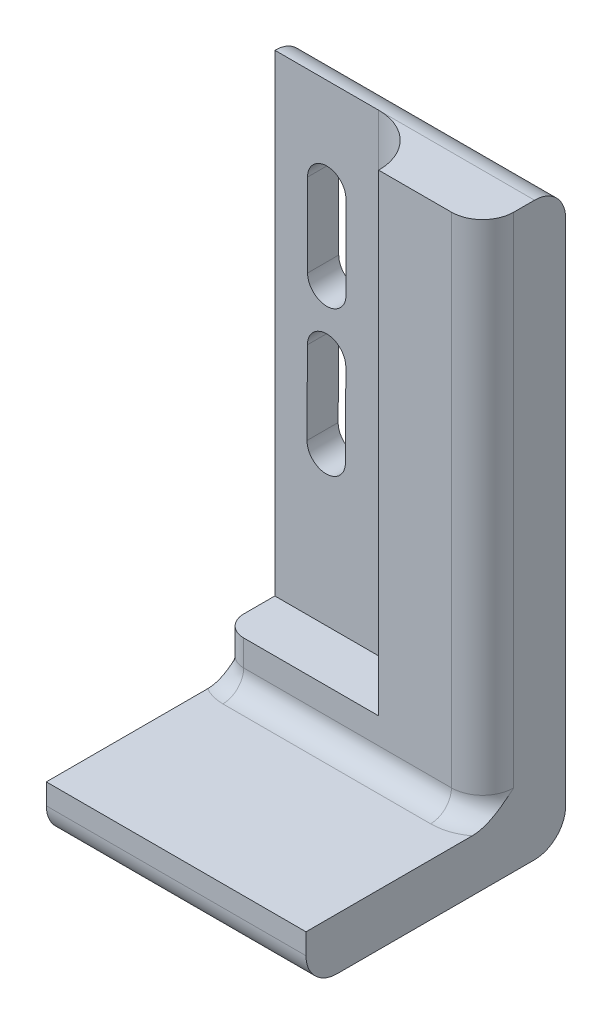
ISO-10303-21;
HEADER;
FILE_DESCRIPTION(('STEP AP214'),'2;1');
FILE_NAME('part.step','',(''),(''),'','','');
FILE_SCHEMA(('AUTOMOTIVE_DESIGN { 1 0 10303 214 1 1 1 1 }'));
ENDSEC;
DATA;
#1=APPLICATION_CONTEXT('core data for automotive mechanical design processes');
#2=APPLICATION_PROTOCOL_DEFINITION('international standard','automotive_design',2000,#1);
#3=PRODUCT_CONTEXT('',#1,'mechanical');
#4=PRODUCT('Part','Part','',(#3));
#5=PRODUCT_RELATED_PRODUCT_CATEGORY('part','',(#4));
#6=PRODUCT_DEFINITION_FORMATION('','',#4);
#7=PRODUCT_DEFINITION_CONTEXT('part definition',#1,'design');
#8=PRODUCT_DEFINITION('design','',#6,#7);
#9=PRODUCT_DEFINITION_SHAPE('','',#8);
#10=(LENGTH_UNIT() NAMED_UNIT(*) SI_UNIT(.MILLI.,.METRE.));
#11=(NAMED_UNIT(*) PLANE_ANGLE_UNIT() SI_UNIT($,.RADIAN.));
#12=(NAMED_UNIT(*) SI_UNIT($,.STERADIAN.) SOLID_ANGLE_UNIT());
#13=UNCERTAINTY_MEASURE_WITH_UNIT(LENGTH_MEASURE(1.E-05),#10,'distance_accuracy_value','');
#14=(GEOMETRIC_REPRESENTATION_CONTEXT(3) GLOBAL_UNCERTAINTY_ASSIGNED_CONTEXT((#13)) GLOBAL_UNIT_ASSIGNED_CONTEXT((#10,
#11,#12)) REPRESENTATION_CONTEXT('',''));
#15=CARTESIAN_POINT('',(0.,0.,0.));
#16=DIRECTION('',(0.,0.,1.));
#17=DIRECTION('',(1.,0.,0.));
#18=AXIS2_PLACEMENT_3D('',#15,#16,#17);
#19=CARTESIAN_POINT('',(0.,0.,0.));
#20=DIRECTION('',(0.,0.,-1.));
#21=DIRECTION('',(-1.,0.,0.));
#22=AXIS2_PLACEMENT_3D('',#19,#20,#21);
#23=PLANE('',#22);
#24=DIRECTION('',(0.,-1.,0.));
#25=VECTOR('',#24,1.);
#26=CARTESIAN_POINT('',(-11.8500000000004,8.00000000000205,0.));
#27=LINE('',#26,#25);
#28=CARTESIAN_POINT('',(-11.8500000000004,16.0000000000021,0.));
#29=VERTEX_POINT('',#28);
#30=CARTESIAN_POINT('',(-11.8500000000004,8.00000000000205,0.));
#31=VERTEX_POINT('',#30);
#32=EDGE_CURVE('E270',#29,#31,#27,.T.);
#33=ORIENTED_EDGE('',*,*,#32,.T.);
#34=CARTESIAN_POINT('',(-10.0000000000004,8.00000000000205,0.));
#35=DIRECTION('',(0.,0.,1.));
#36=DIRECTION('',(1.,0.,0.));
#37=AXIS2_PLACEMENT_3D('',#34,#35,#36);
#38=CIRCLE('',#37,1.85);
#39=CARTESIAN_POINT('',(-8.15000000000039,8.00000000000204,0.));
#40=VERTEX_POINT('',#39);
#41=EDGE_CURVE('E266',#31,#40,#38,.T.);
#42=ORIENTED_EDGE('',*,*,#41,.T.);
#43=DIRECTION('',(0.,1.,0.));
#44=VECTOR('',#43,1.);
#45=CARTESIAN_POINT('',(-8.15000000000039,8.00000000000204,0.));
#46=LINE('',#45,#44);
#47=CARTESIAN_POINT('',(-8.1500000000004,16.0000000000021,0.));
#48=VERTEX_POINT('',#47);
#49=EDGE_CURVE('E280',#40,#48,#46,.T.);
#50=ORIENTED_EDGE('',*,*,#49,.T.);
#51=CARTESIAN_POINT('',(-10.0000000000004,16.0000000000021,0.));
#52=DIRECTION('',(0.,0.,1.));
#53=DIRECTION('',(1.,0.,0.));
#54=AXIS2_PLACEMENT_3D('',#51,#52,#53);
#55=CIRCLE('',#54,1.85);
#56=EDGE_CURVE('E283',#48,#29,#55,.T.);
#57=ORIENTED_EDGE('',*,*,#56,.T.);
#58=EDGE_LOOP('',(#33,#42,#50,#57));
#59=FACE_BOUND('',#58,.T.);
#60=DIRECTION('',(0.00484216557138158,0.999988276647571,0.));
#61=VECTOR('',#60,1.);
#62=CARTESIAN_POINT('',(-8.16454818491653,1.99107716375229,0.));
#63=LINE('',#62,#61);
#64=CARTESIAN_POINT('',(-8.20328550948759,-6.00882904942832,0.));
#65=VERTEX_POINT('',#64);
#66=CARTESIAN_POINT('',(-8.16454818491653,1.99107716375229,0.));
#67=VERTEX_POINT('',#66);
#68=EDGE_CURVE('E239',#65,#67,#63,.T.);
#69=ORIENTED_EDGE('',*,*,#68,.T.);
#70=CARTESIAN_POINT('',(-10.0145264967145,2.00003517005933,0.));
#71=DIRECTION('',(0.,0.,1.));
#72=DIRECTION('',(-1.,0.,0.));
#73=AXIS2_PLACEMENT_3D('',#70,#71,#72);
#74=CIRCLE('',#73,1.85);
#75=CARTESIAN_POINT('',(-11.8645048085125,2.00899317636639,0.));
#76=VERTEX_POINT('',#75);
#77=EDGE_CURVE('E235',#67,#76,#74,.T.);
#78=ORIENTED_EDGE('',*,*,#77,.T.);
#79=DIRECTION('',(-0.00484216557138139,-0.999988276647571,0.));
#80=VECTOR('',#79,1.);
#81=CARTESIAN_POINT('',(-11.8645048085125,2.00899317636639,0.));
#82=LINE('',#81,#80);
#83=CARTESIAN_POINT('',(-11.9032421330836,-5.99091303681418,0.));
#84=VERTEX_POINT('',#83);
#85=EDGE_CURVE('E249',#76,#84,#82,.T.);
#86=ORIENTED_EDGE('',*,*,#85,.T.);
#87=CARTESIAN_POINT('',(-10.0532638212856,-5.99987104312124,0.));
#88=DIRECTION('',(0.,0.,1.));
#89=DIRECTION('',(-1.,0.,0.));
#90=AXIS2_PLACEMENT_3D('',#87,#88,#89);
#91=CIRCLE('',#90,1.85);
#92=EDGE_CURVE('E252',#84,#65,#91,.T.);
#93=ORIENTED_EDGE('',*,*,#92,.T.);
#94=EDGE_LOOP('',(#69,#78,#86,#93));
#95=FACE_BOUND('',#94,.T.);
#96=DIRECTION('',(0.,-1.,0.));
#97=VECTOR('',#96,1.);
#98=CARTESIAN_POINT('',(-15.,-25.,0.));
#99=LINE('',#98,#97);
#100=CARTESIAN_POINT('',(-15.,22.,0.));
#101=VERTEX_POINT('',#100);
#102=CARTESIAN_POINT('',(-15.,-27.,0.));
#103=VERTEX_POINT('',#102);
#104=EDGE_CURVE('E297',#101,#103,#99,.T.);
#105=ORIENTED_EDGE('',*,*,#104,.F.);
#106=DIRECTION('',(-1.,0.,0.));
#107=VECTOR('',#106,1.);
#108=CARTESIAN_POINT('',(10.,22.,0.));
#109=LINE('',#108,#107);
#110=CARTESIAN_POINT('',(10.,22.,0.));
#111=VERTEX_POINT('',#110);
#112=EDGE_CURVE('E348',#101,#111,#109,.F.);
#113=ORIENTED_EDGE('',*,*,#112,.T.);
#114=DIRECTION('',(0.,-1.,0.));
#115=VECTOR('',#114,1.);
#116=CARTESIAN_POINT('',(10.,25.,0.));
#117=LINE('',#116,#115);
#118=CARTESIAN_POINT('',(10.,-27.,0.));
#119=VERTEX_POINT('',#118);
#120=EDGE_CURVE('E485',#111,#119,#117,.T.);
#121=ORIENTED_EDGE('',*,*,#120,.T.);
#122=DIRECTION('',(1.,0.,0.));
#123=VECTOR('',#122,1.);
#124=CARTESIAN_POINT('',(-15.,-27.,0.));
#125=LINE('',#124,#123);
#126=EDGE_CURVE('E346',#119,#103,#125,.F.);
#127=ORIENTED_EDGE('',*,*,#126,.T.);
#128=EDGE_LOOP('',(#105,#113,#121,#127));
#129=FACE_BOUND('',#128,.T.);
#130=ADVANCED_FACE('F37',(#59,#95,#129),#23,.T.);
#131=CARTESIAN_POINT('',(-15.,25.,3.));
#132=DIRECTION('',(0.,-1.,0.));
#133=DIRECTION('',(0.,0.,-1.));
#134=AXIS2_PLACEMENT_3D('',#131,#132,#133);
#135=PLANE('',#134);
#136=DIRECTION('',(-1.,0.,0.));
#137=VECTOR('',#136,1.);
#138=CARTESIAN_POINT('',(0.,25.,8.));
#139=LINE('',#138,#137);
#140=CARTESIAN_POINT('',(7.,25.,8.));
#141=VERTEX_POINT('',#140);
#142=CARTESIAN_POINT('',(0.,25.,8.));
#143=VERTEX_POINT('',#142);
#144=EDGE_CURVE('E494',#141,#143,#139,.T.);
#145=ORIENTED_EDGE('',*,*,#144,.F.);
#146=CARTESIAN_POINT('',(7.,25.,5.));
#147=DIRECTION('',(0.,-1.,0.));
#148=DIRECTION('',(0.,0.,-1.));
#149=AXIS2_PLACEMENT_3D('',#146,#147,#148);
#150=CIRCLE('',#149,3.);
#151=CARTESIAN_POINT('',(10.,25.,5.));
#152=VERTEX_POINT('',#151);
#153=EDGE_CURVE('E330',#141,#152,#150,.F.);
#154=ORIENTED_EDGE('',*,*,#153,.T.);
#155=DIRECTION('',(0.,0.,-1.));
#156=VECTOR('',#155,1.);
#157=CARTESIAN_POINT('',(10.,25.,35.));
#158=LINE('',#157,#156);
#159=CARTESIAN_POINT('',(10.,25.,3.));
#160=VERTEX_POINT('',#159);
#161=EDGE_CURVE('E208',#152,#160,#158,.T.);
#162=ORIENTED_EDGE('',*,*,#161,.T.);
#163=DIRECTION('',(-1.,0.,0.));
#164=VECTOR('',#163,1.);
#165=CARTESIAN_POINT('',(-15.,25.,3.));
#166=LINE('',#165,#164);
#167=CARTESIAN_POINT('',(-5.,25.,3.));
#168=VERTEX_POINT('',#167);
#169=EDGE_CURVE('E327',#160,#168,#166,.T.);
#170=ORIENTED_EDGE('',*,*,#169,.T.);
#171=CARTESIAN_POINT('',(-5.,25.,8.));
#172=DIRECTION('',(0.,-1.,0.));
#173=DIRECTION('',(0.,0.,-1.));
#174=AXIS2_PLACEMENT_3D('',#171,#172,#173);
#175=CIRCLE('',#174,5.);
#176=EDGE_CURVE('E310',#168,#143,#175,.T.);
#177=ORIENTED_EDGE('',*,*,#176,.T.);
#178=EDGE_LOOP('',(#145,#154,#162,#170,#177));
#179=FACE_BOUND('',#178,.T.);
#180=ADVANCED_FACE('F391',(#179),#135,.F.);
#181=CARTESIAN_POINT('',(-15.,-30.,25.));
#182=DIRECTION('',(0.,1.,0.));
#183=DIRECTION('',(0.,0.,1.));
#184=AXIS2_PLACEMENT_3D('',#181,#182,#183);
#185=PLANE('',#184);
#186=DIRECTION('',(0.,0.,-1.));
#187=VECTOR('',#186,1.);
#188=CARTESIAN_POINT('',(10.,-30.,35.));
#189=LINE('',#188,#187);
#190=CARTESIAN_POINT('',(10.,-30.,22.));
#191=VERTEX_POINT('',#190);
#192=CARTESIAN_POINT('',(10.,-30.,3.));
#193=VERTEX_POINT('',#192);
#194=EDGE_CURVE('E488',#191,#193,#189,.T.);
#195=ORIENTED_EDGE('',*,*,#194,.F.);
#196=DIRECTION('',(1.,0.,0.));
#197=VECTOR('',#196,1.);
#198=CARTESIAN_POINT('',(-15.,-30.,22.));
#199=LINE('',#198,#197);
#200=CARTESIAN_POINT('',(-15.,-30.,22.));
#201=VERTEX_POINT('',#200);
#202=EDGE_CURVE('E344',#191,#201,#199,.F.);
#203=ORIENTED_EDGE('',*,*,#202,.T.);
#204=DIRECTION('',(0.,0.,-1.));
#205=VECTOR('',#204,1.);
#206=CARTESIAN_POINT('',(-15.,-30.,25.));
#207=LINE('',#206,#205);
#208=CARTESIAN_POINT('',(-15.,-30.,3.));
#209=VERTEX_POINT('',#208);
#210=EDGE_CURVE('E227',#201,#209,#207,.T.);
#211=ORIENTED_EDGE('',*,*,#210,.T.);
#212=DIRECTION('',(1.,0.,0.));
#213=VECTOR('',#212,1.);
#214=CARTESIAN_POINT('',(10.,-30.,3.));
#215=LINE('',#214,#213);
#216=EDGE_CURVE('E341',#209,#193,#215,.T.);
#217=ORIENTED_EDGE('',*,*,#216,.T.);
#218=EDGE_LOOP('',(#195,#203,#211,#217));
#219=FACE_BOUND('',#218,.T.);
#220=ADVANCED_FACE('F396',(#219),#185,.F.);
#221=CARTESIAN_POINT('',(-15.,-25.,25.));
#222=DIRECTION('',(0.,-1.,0.));
#223=DIRECTION('',(0.,0.,-1.));
#224=AXIS2_PLACEMENT_3D('',#221,#222,#223);
#225=PLANE('',#224);
#226=DIRECTION('',(1.,0.,0.));
#227=VECTOR('',#226,1.);
#228=CARTESIAN_POINT('',(-15.,-25.,10.));
#229=LINE('',#228,#227);
#230=CARTESIAN_POINT('',(7.,-25.,10.));
#231=VERTEX_POINT('',#230);
#232=CARTESIAN_POINT('',(-13.,-25.,10.));
#233=VERTEX_POINT('',#232);
#234=EDGE_CURVE('E350',#231,#233,#229,.F.);
#235=ORIENTED_EDGE('',*,*,#234,.T.);
#236=CARTESIAN_POINT('',(-13.,-25.,6.));
#237=DIRECTION('',(0.,-1.,0.));
#238=DIRECTION('',(0.,0.,-1.));
#239=AXIS2_PLACEMENT_3D('',#236,#237,#238);
#240=CIRCLE('',#239,4.);
#241=CARTESIAN_POINT('',(-15.,-25.,9.46410161513775));
#242=VERTEX_POINT('',#241);
#243=EDGE_CURVE('E354',#233,#242,#240,.T.);
#244=ORIENTED_EDGE('',*,*,#243,.T.);
#245=DIRECTION('',(0.,0.,-1.));
#246=VECTOR('',#245,1.);
#247=CARTESIAN_POINT('',(-15.,-25.,25.));
#248=LINE('',#247,#246);
#249=CARTESIAN_POINT('',(-15.,-25.,25.));
#250=VERTEX_POINT('',#249);
#251=EDGE_CURVE('E223',#250,#242,#248,.T.);
#252=ORIENTED_EDGE('',*,*,#251,.F.);
#253=DIRECTION('',(-1.,0.,0.));
#254=VECTOR('',#253,1.);
#255=CARTESIAN_POINT('',(-15.,-25.,25.));
#256=LINE('',#255,#254);
#257=CARTESIAN_POINT('',(10.,-25.,25.));
#258=VERTEX_POINT('',#257);
#259=EDGE_CURVE('E214',#258,#250,#256,.T.);
#260=ORIENTED_EDGE('',*,*,#259,.F.);
#261=DIRECTION('',(0.,0.,1.));
#262=VECTOR('',#261,1.);
#263=CARTESIAN_POINT('',(10.,-25.,25.));
#264=LINE('',#263,#262);
#265=CARTESIAN_POINT('',(10.,-25.,9.));
#266=VERTEX_POINT('',#265);
#267=EDGE_CURVE('E199',#266,#258,#264,.T.);
#268=ORIENTED_EDGE('',*,*,#267,.F.);
#269=CARTESIAN_POINT('',(7.,-25.,5.));
#270=DIRECTION('',(0.,-1.,0.));
#271=DIRECTION('',(0.,0.,-1.));
#272=AXIS2_PLACEMENT_3D('',#269,#270,#271);
#273=CIRCLE('',#272,5.);
#274=EDGE_CURVE('E352',#266,#231,#273,.T.);
#275=ORIENTED_EDGE('',*,*,#274,.T.);
#276=EDGE_LOOP('',(#235,#244,#252,#260,#268,#275));
#277=FACE_BOUND('',#276,.T.);
#278=ADVANCED_FACE('F220',(#277),#225,.F.);
#279=CARTESIAN_POINT('',(0.,0.,25.));
#280=DIRECTION('',(0.,0.,1.));
#281=DIRECTION('',(1.,0.,0.));
#282=AXIS2_PLACEMENT_3D('',#279,#280,#281);
#283=PLANE('',#282);
#284=DIRECTION('',(0.,-1.,0.));
#285=VECTOR('',#284,1.);
#286=CARTESIAN_POINT('',(-15.,-25.,25.));
#287=LINE('',#286,#285);
#288=CARTESIAN_POINT('',(-15.,-27.,25.));
#289=VERTEX_POINT('',#288);
#290=EDGE_CURVE('E225',#250,#289,#287,.T.);
#291=ORIENTED_EDGE('',*,*,#290,.T.);
#292=DIRECTION('',(1.,0.,0.));
#293=VECTOR('',#292,1.);
#294=CARTESIAN_POINT('',(10.,-27.,25.));
#295=LINE('',#294,#293);
#296=CARTESIAN_POINT('',(10.,-27.,25.));
#297=VERTEX_POINT('',#296);
#298=EDGE_CURVE('E217',#289,#297,#295,.T.);
#299=ORIENTED_EDGE('',*,*,#298,.T.);
#300=DIRECTION('',(0.,1.,0.));
#301=VECTOR('',#300,1.);
#302=CARTESIAN_POINT('',(10.,0.,25.));
#303=LINE('',#302,#301);
#304=EDGE_CURVE('E203',#297,#258,#303,.T.);
#305=ORIENTED_EDGE('',*,*,#304,.T.);
#306=ORIENTED_EDGE('',*,*,#259,.T.);
#307=EDGE_LOOP('',(#291,#299,#305,#306));
#308=FACE_BOUND('',#307,.T.);
#309=ADVANCED_FACE('F213',(#308),#283,.T.);
#310=CARTESIAN_POINT('',(0.,0.,8.));
#311=DIRECTION('',(0.,0.,1.));
#312=DIRECTION('',(1.,0.,0.));
#313=AXIS2_PLACEMENT_3D('',#310,#311,#312);
#314=PLANE('',#313);
#315=DIRECTION('',(0.,-1.,0.));
#316=VECTOR('',#315,1.);
#317=CARTESIAN_POINT('',(-13.,-25.,8.));
#318=LINE('',#317,#316);
#319=CARTESIAN_POINT('',(-13.,-20.5,8.));
#320=VERTEX_POINT('',#319);
#321=CARTESIAN_POINT('',(-13.,-23.,8.));
#322=VERTEX_POINT('',#321);
#323=EDGE_CURVE('E315',#320,#322,#318,.T.);
#324=ORIENTED_EDGE('',*,*,#323,.T.);
#325=DIRECTION('',(1.,0.,0.));
#326=VECTOR('',#325,1.);
#327=CARTESIAN_POINT('',(0.,-23.,8.));
#328=LINE('',#327,#326);
#329=CARTESIAN_POINT('',(7.,-23.,8.));
#330=VERTEX_POINT('',#329);
#331=EDGE_CURVE('E55',#322,#330,#328,.T.);
#332=ORIENTED_EDGE('',*,*,#331,.T.);
#333=DIRECTION('',(0.,1.,0.));
#334=VECTOR('',#333,1.);
#335=CARTESIAN_POINT('',(7.,0.,8.));
#336=LINE('',#335,#334);
#337=EDGE_CURVE('E313',#330,#141,#336,.T.);
#338=ORIENTED_EDGE('',*,*,#337,.T.);
#339=ORIENTED_EDGE('',*,*,#144,.T.);
#340=DIRECTION('',(0.,-1.,0.));
#341=VECTOR('',#340,1.);
#342=CARTESIAN_POINT('',(0.,0.,8.));
#343=LINE('',#342,#341);
#344=CARTESIAN_POINT('',(0.,-20.5,8.));
#345=VERTEX_POINT('',#344);
#346=EDGE_CURVE('E496',#143,#345,#343,.T.);
#347=ORIENTED_EDGE('',*,*,#346,.T.);
#348=DIRECTION('',(-1.,0.,0.));
#349=VECTOR('',#348,1.);
#350=CARTESIAN_POINT('',(0.,-20.5,8.));
#351=LINE('',#350,#349);
#352=EDGE_CURVE('E499',#345,#320,#351,.T.);
#353=ORIENTED_EDGE('',*,*,#352,.T.);
#354=EDGE_LOOP('',(#324,#332,#338,#339,#347,#353));
#355=FACE_BOUND('',#354,.T.);
#356=ADVANCED_FACE('F403',(#355),#314,.T.);
#357=CARTESIAN_POINT('',(0.,0.,3.));
#358=DIRECTION('',(0.,0.,-1.));
#359=DIRECTION('',(-1.,0.,0.));
#360=AXIS2_PLACEMENT_3D('',#357,#358,#359);
#361=PLANE('',#360);
#362=CARTESIAN_POINT('',(-10.0145264967145,2.00003517005933,3.));
#363=DIRECTION('',(0.,0.,1.));
#364=DIRECTION('',(-1.,0.,0.));
#365=AXIS2_PLACEMENT_3D('',#362,#363,#364);
#366=CIRCLE('',#365,1.85);
#367=CARTESIAN_POINT('',(-8.16454818491653,1.99107716375229,3.));
#368=VERTEX_POINT('',#367);
#369=CARTESIAN_POINT('',(-11.8645048085125,2.00899317636639,3.));
#370=VERTEX_POINT('',#369);
#371=EDGE_CURVE('E236',#368,#370,#366,.T.);
#372=ORIENTED_EDGE('',*,*,#371,.F.);
#373=DIRECTION('',(0.00484216557138158,0.999988276647571,0.));
#374=VECTOR('',#373,1.);
#375=CARTESIAN_POINT('',(-8.16454818491653,1.99107716375229,3.));
#376=LINE('',#375,#374);
#377=CARTESIAN_POINT('',(-8.20328550948758,-6.00882904942831,3.));
#378=VERTEX_POINT('',#377);
#379=EDGE_CURVE('E244',#378,#368,#376,.T.);
#380=ORIENTED_EDGE('',*,*,#379,.F.);
#381=CARTESIAN_POINT('',(-10.0532638212856,-5.99987104312124,3.));
#382=DIRECTION('',(0.,0.,1.));
#383=DIRECTION('',(-1.,0.,0.));
#384=AXIS2_PLACEMENT_3D('',#381,#382,#383);
#385=CIRCLE('',#384,1.85);
#386=CARTESIAN_POINT('',(-11.9032421330836,-5.99091303681418,3.));
#387=VERTEX_POINT('',#386);
#388=EDGE_CURVE('E241',#387,#378,#385,.T.);
#389=ORIENTED_EDGE('',*,*,#388,.F.);
#390=DIRECTION('',(-0.00484216557138139,-0.999988276647571,0.));
#391=VECTOR('',#390,1.);
#392=CARTESIAN_POINT('',(-11.8645048085125,2.00899317636639,3.));
#393=LINE('',#392,#391);
#394=EDGE_CURVE('E238',#370,#387,#393,.T.);
#395=ORIENTED_EDGE('',*,*,#394,.F.);
#396=EDGE_LOOP('',(#372,#380,#389,#395));
#397=FACE_BOUND('',#396,.T.);
#398=CARTESIAN_POINT('',(-10.0000000000004,8.00000000000205,3.));
#399=DIRECTION('',(0.,0.,1.));
#400=DIRECTION('',(1.,0.,0.));
#401=AXIS2_PLACEMENT_3D('',#398,#399,#400);
#402=CIRCLE('',#401,1.85);
#403=CARTESIAN_POINT('',(-11.8500000000004,8.00000000000205,3.));
#404=VERTEX_POINT('',#403);
#405=CARTESIAN_POINT('',(-8.15000000000039,8.00000000000204,3.));
#406=VERTEX_POINT('',#405);
#407=EDGE_CURVE('E267',#404,#406,#402,.T.);
#408=ORIENTED_EDGE('',*,*,#407,.F.);
#409=DIRECTION('',(0.,-1.,0.));
#410=VECTOR('',#409,1.);
#411=CARTESIAN_POINT('',(-11.8500000000004,8.00000000000205,3.));
#412=LINE('',#411,#410);
#413=CARTESIAN_POINT('',(-11.8500000000004,16.0000000000021,3.));
#414=VERTEX_POINT('',#413);
#415=EDGE_CURVE('E275',#414,#404,#412,.T.);
#416=ORIENTED_EDGE('',*,*,#415,.F.);
#417=CARTESIAN_POINT('',(-10.0000000000004,16.0000000000021,3.));
#418=DIRECTION('',(0.,0.,1.));
#419=DIRECTION('',(1.,0.,0.));
#420=AXIS2_PLACEMENT_3D('',#417,#418,#419);
#421=CIRCLE('',#420,1.85);
#422=CARTESIAN_POINT('',(-8.1500000000004,16.0000000000021,3.));
#423=VERTEX_POINT('',#422);
#424=EDGE_CURVE('E272',#423,#414,#421,.T.);
#425=ORIENTED_EDGE('',*,*,#424,.F.);
#426=DIRECTION('',(0.,1.,0.));
#427=VECTOR('',#426,1.);
#428=CARTESIAN_POINT('',(-8.15000000000039,8.00000000000204,3.));
#429=LINE('',#428,#427);
#430=EDGE_CURVE('E269',#406,#423,#429,.T.);
#431=ORIENTED_EDGE('',*,*,#430,.F.);
#432=EDGE_LOOP('',(#408,#416,#425,#431));
#433=FACE_BOUND('',#432,.T.);
#434=DIRECTION('',(-1.,0.,0.));
#435=VECTOR('',#434,1.);
#436=CARTESIAN_POINT('',(0.,-20.5,3.));
#437=LINE('',#436,#435);
#438=CARTESIAN_POINT('',(-5.,-20.5,3.));
#439=VERTEX_POINT('',#438);
#440=CARTESIAN_POINT('',(-15.,-20.5,3.));
#441=VERTEX_POINT('',#440);
#442=EDGE_CURVE('E218',#439,#441,#437,.T.);
#443=ORIENTED_EDGE('',*,*,#442,.F.);
#444=DIRECTION('',(0.,-1.,0.));
#445=VECTOR('',#444,1.);
#446=CARTESIAN_POINT('',(-5.,25.,3.));
#447=LINE('',#446,#445);
#448=EDGE_CURVE('E307',#439,#168,#447,.F.);
#449=ORIENTED_EDGE('',*,*,#448,.T.);
#450=DIRECTION('',(-1.,0.,0.));
#451=VECTOR('',#450,1.);
#452=CARTESIAN_POINT('',(-15.,25.,3.));
#453=LINE('',#452,#451);
#454=CARTESIAN_POINT('',(-15.,25.,3.));
#455=VERTEX_POINT('',#454);
#456=EDGE_CURVE('E298',#168,#455,#453,.T.);
#457=ORIENTED_EDGE('',*,*,#456,.T.);
#458=DIRECTION('',(0.,-1.,0.));
#459=VECTOR('',#458,1.);
#460=CARTESIAN_POINT('',(-15.,-25.,3.));
#461=LINE('',#460,#459);
#462=EDGE_CURVE('E300',#455,#441,#461,.T.);
#463=ORIENTED_EDGE('',*,*,#462,.T.);
#464=EDGE_LOOP('',(#443,#449,#457,#463));
#465=FACE_BOUND('',#464,.T.);
#466=ADVANCED_FACE('F400',(#397,#433,#465),#361,.F.);
#467=CARTESIAN_POINT('',(-15.,-25.,3.));
#468=DIRECTION('',(1.,0.,0.));
#469=DIRECTION('',(0.,0.,-1.));
#470=AXIS2_PLACEMENT_3D('',#467,#468,#469);
#471=PLANE('',#470);
#472=ORIENTED_EDGE('',*,*,#251,.T.);
#473=CARTESIAN_POINT('',(-15.,-25.,9.46410161513775));
#474=CARTESIAN_POINT('',(-15.,-25.0000118494146,9.37840629812424));
#475=CARTESIAN_POINT('',(-15.,-24.995871060249,9.29276105949715));
#476=CARTESIAN_POINT('',(-15.,-24.9798529395462,9.12232102480822));
#477=CARTESIAN_POINT('',(-15.,-24.9679873814855,9.03752513361608));
#478=CARTESIAN_POINT('',(-15.,-24.9372712269331,8.87028314530651));
#479=CARTESIAN_POINT('',(-15.,-24.9185064976321,8.78782104681794));
#480=CARTESIAN_POINT('',(-15.,-24.8745611709319,8.62459895216407));
#481=CARTESIAN_POINT('',(-15.,-24.8493775087196,8.5438397890896));
#482=CARTESIAN_POINT('',(-15.,-24.7827529457404,8.35473249508657));
#483=CARTESIAN_POINT('',(-15.,-24.7387483878324,8.24728415660278));
#484=CARTESIAN_POINT('',(-15.,-24.6413542826815,8.03669276727359));
#485=CARTESIAN_POINT('',(-15.,-24.5879572292124,7.93355324211471));
#486=CARTESIAN_POINT('',(-15.,-24.4154624523898,7.6299986678065));
#487=CARTESIAN_POINT('',(-15.,-24.2844093423367,7.43636862067546));
#488=CARTESIAN_POINT('',(-15.,-23.9727597695962,7.02688369414126));
#489=CARTESIAN_POINT('',(-15.,-23.7875225195169,6.81471515121596));
#490=CARTESIAN_POINT('',(-15.,-23.403641546762,6.40378336819428));
#491=CARTESIAN_POINT('',(-15.,-23.2050083520991,6.20500984089031));
#492=CARTESIAN_POINT('',(-15.,-23.0042163679689,6.00421636814438));
#493=CARTESIAN_POINT('',(-15.,-23.0021081828215,6.00210818300135));
#494=CARTESIAN_POINT('',(-15.,-23.,6.));
#495=B_SPLINE_CURVE_WITH_KNOTS('',3,(#473,#474,#475,#476,#477,#478,#479,#480,#481,#482,#483,
#484,#485,#486,#487,#488,#489,#490,#491,#492,#493,#494),.UNSPECIFIED.,.F.,.F.,(4,2,2,2,2,2,2,2,
2,2,4),(0.,0.256912595778,0.513434539685442,0.76686629139051,1.02041927520561,1.36819331305802,
1.71624655574892,2.41527069662684,3.25887239086184,4.10181864660846,4.11076291851909),.UNSPECIFIED.);
#496=CARTESIAN_POINT('',(-15.,-23.,6.));
#497=VERTEX_POINT('',#496);
#498=EDGE_CURVE('E47',#242,#497,#495,.T.);
#499=ORIENTED_EDGE('',*,*,#498,.T.);
#500=DIRECTION('',(0.,-1.,0.));
#501=VECTOR('',#500,1.);
#502=CARTESIAN_POINT('',(-15.,-20.5,6.));
#503=LINE('',#502,#501);
#504=CARTESIAN_POINT('',(-15.,-20.5,6.));
#505=VERTEX_POINT('',#504);
#506=EDGE_CURVE('E323',#497,#505,#503,.F.);
#507=ORIENTED_EDGE('',*,*,#506,.T.);
#508=DIRECTION('',(0.,0.,-1.));
#509=VECTOR('',#508,1.);
#510=CARTESIAN_POINT('',(-15.,-20.5,8.));
#511=LINE('',#510,#509);
#512=EDGE_CURVE('E229',#505,#441,#511,.T.);
#513=ORIENTED_EDGE('',*,*,#512,.T.);
#514=ORIENTED_EDGE('',*,*,#462,.F.);
#515=CARTESIAN_POINT('',(-15.,22.,3.));
#516=DIRECTION('',(1.,0.,0.));
#517=DIRECTION('',(0.,0.,-1.));
#518=AXIS2_PLACEMENT_3D('',#515,#516,#517);
#519=CIRCLE('',#518,3.);
#520=EDGE_CURVE('E319',#455,#101,#519,.F.);
#521=ORIENTED_EDGE('',*,*,#520,.T.);
#522=ORIENTED_EDGE('',*,*,#104,.T.);
#523=CARTESIAN_POINT('',(-15.,-27.,3.));
#524=DIRECTION('',(1.,0.,0.));
#525=DIRECTION('',(0.,0.,-1.));
#526=AXIS2_PLACEMENT_3D('',#523,#524,#525);
#527=CIRCLE('',#526,3.);
#528=EDGE_CURVE('E317',#103,#209,#527,.F.);
#529=ORIENTED_EDGE('',*,*,#528,.T.);
#530=ORIENTED_EDGE('',*,*,#210,.F.);
#531=CARTESIAN_POINT('',(-15.,-27.,22.));
#532=DIRECTION('',(1.,0.,0.));
#533=DIRECTION('',(0.,0.,-1.));
#534=AXIS2_PLACEMENT_3D('',#531,#532,#533);
#535=CIRCLE('',#534,3.);
#536=EDGE_CURVE('E321',#201,#289,#535,.F.);
#537=ORIENTED_EDGE('',*,*,#536,.T.);
#538=ORIENTED_EDGE('',*,*,#290,.F.);
#539=EDGE_LOOP('',(#472,#499,#507,#513,#514,#521,#522,#529,#530,#537,#538));
#540=FACE_BOUND('',#539,.T.);
#541=ADVANCED_FACE('F371',(#540),#471,.F.);
#542=CARTESIAN_POINT('',(-10.0000000000004,8.00000000000205,3.));
#543=DIRECTION('',(0.,0.,-1.));
#544=DIRECTION('',(-1.,0.,0.));
#545=AXIS2_PLACEMENT_3D('',#542,#543,#544);
#546=CYLINDRICAL_SURFACE('',#545,1.85);
#547=ORIENTED_EDGE('',*,*,#41,.F.);
#548=DIRECTION('',(0.,0.,-1.));
#549=VECTOR('',#548,1.);
#550=CARTESIAN_POINT('',(-11.8500000000004,8.00000000000205,3.));
#551=LINE('',#550,#549);
#552=EDGE_CURVE('E277',#404,#31,#551,.T.);
#553=ORIENTED_EDGE('',*,*,#552,.F.);
#554=ORIENTED_EDGE('',*,*,#407,.T.);
#555=DIRECTION('',(0.,0.,-1.));
#556=VECTOR('',#555,1.);
#557=CARTESIAN_POINT('',(-8.15000000000039,8.00000000000204,3.));
#558=LINE('',#557,#556);
#559=EDGE_CURVE('E294',#406,#40,#558,.T.);
#560=ORIENTED_EDGE('',*,*,#559,.T.);
#561=EDGE_LOOP('',(#547,#553,#554,#560));
#562=FACE_BOUND('',#561,.T.);
#563=ADVANCED_FACE('F405',(#562),#546,.F.);
#564=CARTESIAN_POINT('',(-8.15000000000039,8.00000000000204,3.));
#565=DIRECTION('',(-1.,0.,0.));
#566=DIRECTION('',(0.,-1.,0.));
#567=AXIS2_PLACEMENT_3D('',#564,#565,#566);
#568=PLANE('',#567);
#569=ORIENTED_EDGE('',*,*,#49,.F.);
#570=ORIENTED_EDGE('',*,*,#559,.F.);
#571=ORIENTED_EDGE('',*,*,#430,.T.);
#572=DIRECTION('',(0.,0.,-1.));
#573=VECTOR('',#572,1.);
#574=CARTESIAN_POINT('',(-8.1500000000004,16.0000000000021,3.));
#575=LINE('',#574,#573);
#576=EDGE_CURVE('E292',#423,#48,#575,.T.);
#577=ORIENTED_EDGE('',*,*,#576,.T.);
#578=EDGE_LOOP('',(#569,#570,#571,#577));
#579=FACE_BOUND('',#578,.T.);
#580=ADVANCED_FACE('F408',(#579),#568,.T.);
#581=CARTESIAN_POINT('',(-10.0000000000004,16.0000000000021,3.));
#582=DIRECTION('',(0.,0.,-1.));
#583=DIRECTION('',(-1.,0.,0.));
#584=AXIS2_PLACEMENT_3D('',#581,#582,#583);
#585=CYLINDRICAL_SURFACE('',#584,1.85);
#586=ORIENTED_EDGE('',*,*,#56,.F.);
#587=ORIENTED_EDGE('',*,*,#576,.F.);
#588=ORIENTED_EDGE('',*,*,#424,.T.);
#589=DIRECTION('',(0.,0.,-1.));
#590=VECTOR('',#589,1.);
#591=CARTESIAN_POINT('',(-11.8500000000004,16.0000000000021,3.));
#592=LINE('',#591,#590);
#593=EDGE_CURVE('E290',#414,#29,#592,.T.);
#594=ORIENTED_EDGE('',*,*,#593,.T.);
#595=EDGE_LOOP('',(#586,#587,#588,#594));
#596=FACE_BOUND('',#595,.T.);
#597=ADVANCED_FACE('F412',(#596),#585,.F.);
#598=CARTESIAN_POINT('',(-11.8500000000004,8.00000000000205,3.));
#599=DIRECTION('',(1.,0.,0.));
#600=DIRECTION('',(0.,1.,0.));
#601=AXIS2_PLACEMENT_3D('',#598,#599,#600);
#602=PLANE('',#601);
#603=ORIENTED_EDGE('',*,*,#32,.F.);
#604=ORIENTED_EDGE('',*,*,#593,.F.);
#605=ORIENTED_EDGE('',*,*,#415,.T.);
#606=ORIENTED_EDGE('',*,*,#552,.T.);
#607=EDGE_LOOP('',(#603,#604,#605,#606));
#608=FACE_BOUND('',#607,.T.);
#609=ADVANCED_FACE('F416',(#608),#602,.T.);
#610=CARTESIAN_POINT('',(-10.0145264967145,2.00003517005933,3.));
#611=DIRECTION('',(0.,0.,-1.));
#612=DIRECTION('',(-1.,0.,0.));
#613=AXIS2_PLACEMENT_3D('',#610,#611,#612);
#614=CYLINDRICAL_SURFACE('',#613,1.85);
#615=ORIENTED_EDGE('',*,*,#77,.F.);
#616=DIRECTION('',(0.,0.,-1.));
#617=VECTOR('',#616,1.);
#618=CARTESIAN_POINT('',(-8.16454818491653,1.99107716375229,3.));
#619=LINE('',#618,#617);
#620=EDGE_CURVE('E246',#368,#67,#619,.T.);
#621=ORIENTED_EDGE('',*,*,#620,.F.);
#622=ORIENTED_EDGE('',*,*,#371,.T.);
#623=DIRECTION('',(0.,0.,-1.));
#624=VECTOR('',#623,1.);
#625=CARTESIAN_POINT('',(-11.8645048085125,2.00899317636639,3.));
#626=LINE('',#625,#624);
#627=EDGE_CURVE('E263',#370,#76,#626,.T.);
#628=ORIENTED_EDGE('',*,*,#627,.T.);
#629=EDGE_LOOP('',(#615,#621,#622,#628));
#630=FACE_BOUND('',#629,.T.);
#631=ADVANCED_FACE('F420',(#630),#614,.F.);
#632=CARTESIAN_POINT('',(-11.8645048085125,2.00899317636639,3.));
#633=DIRECTION('',(0.999988276647571,-0.00484216557138139,0.));
#634=DIRECTION('',(0.00484216557138139,0.999988276647571,0.));
#635=AXIS2_PLACEMENT_3D('',#632,#633,#634);
#636=PLANE('',#635);
#637=ORIENTED_EDGE('',*,*,#85,.F.);
#638=ORIENTED_EDGE('',*,*,#627,.F.);
#639=ORIENTED_EDGE('',*,*,#394,.T.);
#640=DIRECTION('',(0.,0.,-1.));
#641=VECTOR('',#640,1.);
#642=CARTESIAN_POINT('',(-11.9032421330836,-5.99091303681418,3.));
#643=LINE('',#642,#641);
#644=EDGE_CURVE('E261',#387,#84,#643,.T.);
#645=ORIENTED_EDGE('',*,*,#644,.T.);
#646=EDGE_LOOP('',(#637,#638,#639,#645));
#647=FACE_BOUND('',#646,.T.);
#648=ADVANCED_FACE('F424',(#647),#636,.T.);
#649=CARTESIAN_POINT('',(-10.0532638212856,-5.99987104312124,3.));
#650=DIRECTION('',(0.,0.,-1.));
#651=DIRECTION('',(-1.,0.,0.));
#652=AXIS2_PLACEMENT_3D('',#649,#650,#651);
#653=CYLINDRICAL_SURFACE('',#652,1.85);
#654=ORIENTED_EDGE('',*,*,#92,.F.);
#655=ORIENTED_EDGE('',*,*,#644,.F.);
#656=ORIENTED_EDGE('',*,*,#388,.T.);
#657=DIRECTION('',(0.,0.,-1.));
#658=VECTOR('',#657,1.);
#659=CARTESIAN_POINT('',(-8.20328550948759,-6.00882904942832,3.));
#660=LINE('',#659,#658);
#661=EDGE_CURVE('E259',#378,#65,#660,.T.);
#662=ORIENTED_EDGE('',*,*,#661,.T.);
#663=EDGE_LOOP('',(#654,#655,#656,#662));
#664=FACE_BOUND('',#663,.T.);
#665=ADVANCED_FACE('F428',(#664),#653,.F.);
#666=CARTESIAN_POINT('',(-8.16454818491653,1.99107716375229,3.));
#667=DIRECTION('',(-0.999988276647571,0.00484216557138158,0.));
#668=DIRECTION('',(-0.00484216557138158,-0.999988276647571,0.));
#669=AXIS2_PLACEMENT_3D('',#666,#667,#668);
#670=PLANE('',#669);
#671=ORIENTED_EDGE('',*,*,#68,.F.);
#672=ORIENTED_EDGE('',*,*,#661,.F.);
#673=ORIENTED_EDGE('',*,*,#379,.T.);
#674=ORIENTED_EDGE('',*,*,#620,.T.);
#675=EDGE_LOOP('',(#671,#672,#673,#674));
#676=FACE_BOUND('',#675,.T.);
#677=ADVANCED_FACE('F432',(#676),#670,.T.);
#678=CARTESIAN_POINT('',(0.,-20.5,8.));
#679=DIRECTION('',(0.,-1.,0.));
#680=DIRECTION('',(0.,0.,-1.));
#681=AXIS2_PLACEMENT_3D('',#678,#679,#680);
#682=PLANE('',#681);
#683=ORIENTED_EDGE('',*,*,#512,.F.);
#684=CARTESIAN_POINT('',(-13.,-20.5,6.));
#685=DIRECTION('',(0.,-1.,0.));
#686=DIRECTION('',(0.,0.,-1.));
#687=AXIS2_PLACEMENT_3D('',#684,#685,#686);
#688=CIRCLE('',#687,2.);
#689=EDGE_CURVE('E325',#505,#320,#688,.F.);
#690=ORIENTED_EDGE('',*,*,#689,.T.);
#691=ORIENTED_EDGE('',*,*,#352,.F.);
#692=CARTESIAN_POINT('',(-5.,-20.5,8.));
#693=DIRECTION('',(0.,-1.,0.));
#694=DIRECTION('',(0.,0.,-1.));
#695=AXIS2_PLACEMENT_3D('',#692,#693,#694);
#696=CIRCLE('',#695,5.);
#697=EDGE_CURVE('E303',#345,#439,#696,.F.);
#698=ORIENTED_EDGE('',*,*,#697,.T.);
#699=ORIENTED_EDGE('',*,*,#442,.T.);
#700=EDGE_LOOP('',(#683,#690,#691,#698,#699));
#701=FACE_BOUND('',#700,.T.);
#702=ADVANCED_FACE('F436',(#701),#682,.F.);
#703=CARTESIAN_POINT('',(10.,25.,35.));
#704=DIRECTION('',(1.,0.,0.));
#705=DIRECTION('',(0.,1.,0.));
#706=AXIS2_PLACEMENT_3D('',#703,#704,#705);
#707=PLANE('',#706);
#708=ORIENTED_EDGE('',*,*,#161,.F.);
#709=DIRECTION('',(0.,1.,0.));
#710=VECTOR('',#709,1.);
#711=CARTESIAN_POINT('',(10.,25.,5.));
#712=LINE('',#711,#710);
#713=CARTESIAN_POINT('',(10.,-23.,5.));
#714=VERTEX_POINT('',#713);
#715=EDGE_CURVE('E338',#152,#714,#712,.F.);
#716=ORIENTED_EDGE('',*,*,#715,.T.);
#717=CARTESIAN_POINT('',(10.,-25.,9.));
#718=CARTESIAN_POINT('',(10.,-24.999993454374,8.82973554816672));
#719=CARTESIAN_POINT('',(10.,-24.9861147049804,8.66011188174203));
#720=CARTESIAN_POINT('',(10.,-24.9349068773309,8.32606880814235));
#721=CARTESIAN_POINT('',(10.,-24.8978104765479,8.16161456926));
#722=CARTESIAN_POINT('',(10.,-24.7701386996573,7.72029967012658));
#723=CARTESIAN_POINT('',(10.,-24.6602928117449,7.44910470131436));
#724=CARTESIAN_POINT('',(10.,-24.4009562870675,6.92536833000664));
#725=CARTESIAN_POINT('',(10.,-24.2512110343876,6.67296054309165));
#726=CARTESIAN_POINT('',(10.,-23.9250154995539,6.180134530436));
#727=CARTESIAN_POINT('',(10.,-23.7481406450345,5.94000643174717));
#728=CARTESIAN_POINT('',(9.99999999999999,-23.3831591507299,5.46940384817565));
#729=CARTESIAN_POINT('',(9.99999999999996,-23.1950713444907,5.23891422399073));
#730=CARTESIAN_POINT('',(10.,-23.0046188000557,5.00565685357249));
#731=CARTESIAN_POINT('',(10.,-23.0023093989348,5.00282842642946));
#732=CARTESIAN_POINT('',(10.,-23.,5.));
#733=B_SPLINE_CURVE_WITH_KNOTS('',3,(#717,#718,#719,#720,#721,#722,#723,#724,#725,#726,#727,
#728,#729,#730,#731,#732),.UNSPECIFIED.,.F.,.F.,(4,2,2,2,2,2,2,4),(0.,0.509280709400552,
1.0135375937929,1.88623624683687,2.76464320655833,3.65854903007485,4.55099356350138,
4.56194801465148),.UNSPECIFIED.);
#734=EDGE_CURVE('E12',#714,#266,#733,.F.);
#735=ORIENTED_EDGE('',*,*,#734,.T.);
#736=ORIENTED_EDGE('',*,*,#267,.T.);
#737=ORIENTED_EDGE('',*,*,#304,.F.);
#738=CARTESIAN_POINT('',(10.,-27.,22.));
#739=DIRECTION('',(1.,0.,0.));
#740=DIRECTION('',(0.,1.,0.));
#741=AXIS2_PLACEMENT_3D('',#738,#739,#740);
#742=CIRCLE('',#741,3.);
#743=EDGE_CURVE('E336',#297,#191,#742,.T.);
#744=ORIENTED_EDGE('',*,*,#743,.T.);
#745=ORIENTED_EDGE('',*,*,#194,.T.);
#746=CARTESIAN_POINT('',(10.,-27.,3.));
#747=DIRECTION('',(1.,0.,0.));
#748=DIRECTION('',(0.,1.,0.));
#749=AXIS2_PLACEMENT_3D('',#746,#747,#748);
#750=CIRCLE('',#749,3.);
#751=EDGE_CURVE('E332',#193,#119,#750,.T.);
#752=ORIENTED_EDGE('',*,*,#751,.T.);
#753=ORIENTED_EDGE('',*,*,#120,.F.);
#754=CARTESIAN_POINT('',(10.,22.,3.));
#755=DIRECTION('',(1.,0.,0.));
#756=DIRECTION('',(0.,1.,0.));
#757=AXIS2_PLACEMENT_3D('',#754,#755,#756);
#758=CIRCLE('',#757,3.);
#759=EDGE_CURVE('E334',#111,#160,#758,.T.);
#760=ORIENTED_EDGE('',*,*,#759,.T.);
#761=EDGE_LOOP('',(#708,#716,#735,#736,#737,#744,#745,#752,#753,#760));
#762=FACE_BOUND('',#761,.T.);
#763=ADVANCED_FACE('F202',(#762),#707,.T.);
#764=CARTESIAN_POINT('',(-5.,0.,8.));
#765=DIRECTION('',(0.,1.,0.));
#766=DIRECTION('',(0.,0.,1.));
#767=AXIS2_PLACEMENT_3D('',#764,#765,#766);
#768=CYLINDRICAL_SURFACE('',#767,5.);
#769=ORIENTED_EDGE('',*,*,#176,.F.);
#770=ORIENTED_EDGE('',*,*,#448,.F.);
#771=ORIENTED_EDGE('',*,*,#697,.F.);
#772=ORIENTED_EDGE('',*,*,#346,.F.);
#773=EDGE_LOOP('',(#769,#770,#771,#772));
#774=FACE_BOUND('',#773,.T.);
#775=ADVANCED_FACE('F451',(#774),#768,.F.);
#776=CARTESIAN_POINT('',(-13.,0.,6.));
#777=DIRECTION('',(0.,1.,0.));
#778=DIRECTION('',(0.,0.,1.));
#779=AXIS2_PLACEMENT_3D('',#776,#777,#778);
#780=CYLINDRICAL_SURFACE('',#779,2.);
#781=ORIENTED_EDGE('',*,*,#506,.F.);
#782=CARTESIAN_POINT('',(-13.,-23.,6.));
#783=DIRECTION('',(0.,-1.,0.));
#784=DIRECTION('',(0.,0.,-1.));
#785=AXIS2_PLACEMENT_3D('',#782,#783,#784);
#786=CIRCLE('',#785,2.);
#787=EDGE_CURVE('E356',#497,#322,#786,.F.);
#788=ORIENTED_EDGE('',*,*,#787,.T.);
#789=ORIENTED_EDGE('',*,*,#323,.F.);
#790=ORIENTED_EDGE('',*,*,#689,.F.);
#791=EDGE_LOOP('',(#781,#788,#789,#790));
#792=FACE_BOUND('',#791,.T.);
#793=ADVANCED_FACE('F455',(#792),#780,.T.);
#794=CARTESIAN_POINT('',(7.,0.,5.));
#795=DIRECTION('',(0.,1.,0.));
#796=DIRECTION('',(-1.,0.,0.));
#797=AXIS2_PLACEMENT_3D('',#794,#795,#796);
#798=CYLINDRICAL_SURFACE('',#797,3.);
#799=ORIENTED_EDGE('',*,*,#337,.F.);
#800=CARTESIAN_POINT('',(7.,-23.,5.));
#801=DIRECTION('',(0.,-1.,0.));
#802=DIRECTION('',(0.,0.,-1.));
#803=AXIS2_PLACEMENT_3D('',#800,#801,#802);
#804=CIRCLE('',#803,3.);
#805=EDGE_CURVE('E62',#330,#714,#804,.F.);
#806=ORIENTED_EDGE('',*,*,#805,.T.);
#807=ORIENTED_EDGE('',*,*,#715,.F.);
#808=ORIENTED_EDGE('',*,*,#153,.F.);
#809=EDGE_LOOP('',(#799,#806,#807,#808));
#810=FACE_BOUND('',#809,.T.);
#811=ADVANCED_FACE('F461',(#810),#798,.T.);
#812=CARTESIAN_POINT('',(0.,-27.,22.));
#813=DIRECTION('',(-1.,0.,0.));
#814=DIRECTION('',(0.,0.,1.));
#815=AXIS2_PLACEMENT_3D('',#812,#813,#814);
#816=CYLINDRICAL_SURFACE('',#815,3.);
#817=ORIENTED_EDGE('',*,*,#536,.F.);
#818=ORIENTED_EDGE('',*,*,#202,.F.);
#819=ORIENTED_EDGE('',*,*,#743,.F.);
#820=ORIENTED_EDGE('',*,*,#298,.F.);
#821=EDGE_LOOP('',(#817,#818,#819,#820));
#822=FACE_BOUND('',#821,.T.);
#823=ADVANCED_FACE('F468',(#822),#816,.T.);
#824=CARTESIAN_POINT('',(-15.,22.,3.));
#825=DIRECTION('',(1.,0.,0.));
#826=DIRECTION('',(0.,0.,-1.));
#827=AXIS2_PLACEMENT_3D('',#824,#825,#826);
#828=CYLINDRICAL_SURFACE('',#827,3.);
#829=ORIENTED_EDGE('',*,*,#759,.F.);
#830=ORIENTED_EDGE('',*,*,#112,.F.);
#831=ORIENTED_EDGE('',*,*,#520,.F.);
#832=ORIENTED_EDGE('',*,*,#456,.F.);
#833=ORIENTED_EDGE('',*,*,#169,.F.);
#834=EDGE_LOOP('',(#829,#830,#831,#832,#833));
#835=FACE_BOUND('',#834,.T.);
#836=ADVANCED_FACE('F470',(#835),#828,.T.);
#837=CARTESIAN_POINT('',(-15.,-27.,3.));
#838=DIRECTION('',(-1.,0.,0.));
#839=DIRECTION('',(0.,0.,1.));
#840=AXIS2_PLACEMENT_3D('',#837,#838,#839);
#841=CYLINDRICAL_SURFACE('',#840,3.);
#842=ORIENTED_EDGE('',*,*,#528,.F.);
#843=ORIENTED_EDGE('',*,*,#126,.F.);
#844=ORIENTED_EDGE('',*,*,#751,.F.);
#845=ORIENTED_EDGE('',*,*,#216,.F.);
#846=EDGE_LOOP('',(#842,#843,#844,#845));
#847=FACE_BOUND('',#846,.T.);
#848=ADVANCED_FACE('F381',(#847),#841,.T.);
#849=CARTESIAN_POINT('',(7.,-23.,5.));
#850=DIRECTION('',(0.,-1.,0.));
#851=DIRECTION('',(0.,0.,-1.));
#852=AXIS2_PLACEMENT_3D('',#849,#850,#851);
#853=TOROIDAL_SURFACE('',#852,5.,2.);
#854=ORIENTED_EDGE('',*,*,#734,.F.);
#855=ORIENTED_EDGE('',*,*,#805,.F.);
#856=CARTESIAN_POINT('',(7.,-23.,10.));
#857=DIRECTION('',(1.,0.,0.));
#858=DIRECTION('',(0.,0.,-1.));
#859=AXIS2_PLACEMENT_3D('',#856,#857,#858);
#860=CIRCLE('',#859,2.);
#861=EDGE_CURVE('E42',#231,#330,#860,.T.);
#862=ORIENTED_EDGE('',*,*,#861,.F.);
#863=ORIENTED_EDGE('',*,*,#274,.F.);
#864=EDGE_LOOP('',(#854,#855,#862,#863));
#865=FACE_BOUND('',#864,.T.);
#866=ADVANCED_FACE('F39',(#865),#853,.F.);
#867=CARTESIAN_POINT('',(0.,-23.,10.));
#868=DIRECTION('',(1.,0.,0.));
#869=DIRECTION('',(0.,0.,-1.));
#870=AXIS2_PLACEMENT_3D('',#867,#868,#869);
#871=CYLINDRICAL_SURFACE('',#870,2.);
#872=ORIENTED_EDGE('',*,*,#861,.T.);
#873=ORIENTED_EDGE('',*,*,#331,.F.);
#874=CARTESIAN_POINT('',(-13.,-23.,10.));
#875=DIRECTION('',(1.,0.,0.));
#876=DIRECTION('',(0.,0.,-1.));
#877=AXIS2_PLACEMENT_3D('',#874,#875,#876);
#878=CIRCLE('',#877,2.);
#879=EDGE_CURVE('E526',#233,#322,#878,.T.);
#880=ORIENTED_EDGE('',*,*,#879,.F.);
#881=ORIENTED_EDGE('',*,*,#234,.F.);
#882=EDGE_LOOP('',(#872,#873,#880,#881));
#883=FACE_BOUND('',#882,.T.);
#884=ADVANCED_FACE('F379',(#883),#871,.F.);
#885=CARTESIAN_POINT('',(-13.,-23.,6.));
#886=DIRECTION('',(0.,-1.,0.));
#887=DIRECTION('',(0.,0.,-1.));
#888=AXIS2_PLACEMENT_3D('',#885,#886,#887);
#889=TOROIDAL_SURFACE('',#888,4.,2.);
#890=ORIENTED_EDGE('',*,*,#879,.T.);
#891=ORIENTED_EDGE('',*,*,#787,.F.);
#892=ORIENTED_EDGE('',*,*,#498,.F.);
#893=ORIENTED_EDGE('',*,*,#243,.F.);
#894=EDGE_LOOP('',(#890,#891,#892,#893));
#895=FACE_BOUND('',#894,.T.);
#896=ADVANCED_FACE('F375',(#895),#889,.F.);
#897=CLOSED_SHELL('',(#130,#180,#220,#278,#309,#356,#466,#541,#563,#580,#597,#609,#631,#648,
#665,#677,#702,#763,#775,#793,#811,#823,#836,#848,#866,#884,#896));
#898=MANIFOLD_SOLID_BREP('B2',#897);
#899=ADVANCED_BREP_SHAPE_REPRESENTATION('',(#18,#898),#14);
#900=SHAPE_DEFINITION_REPRESENTATION(#9,#899);
ENDSEC;
END-ISO-10303-21;
